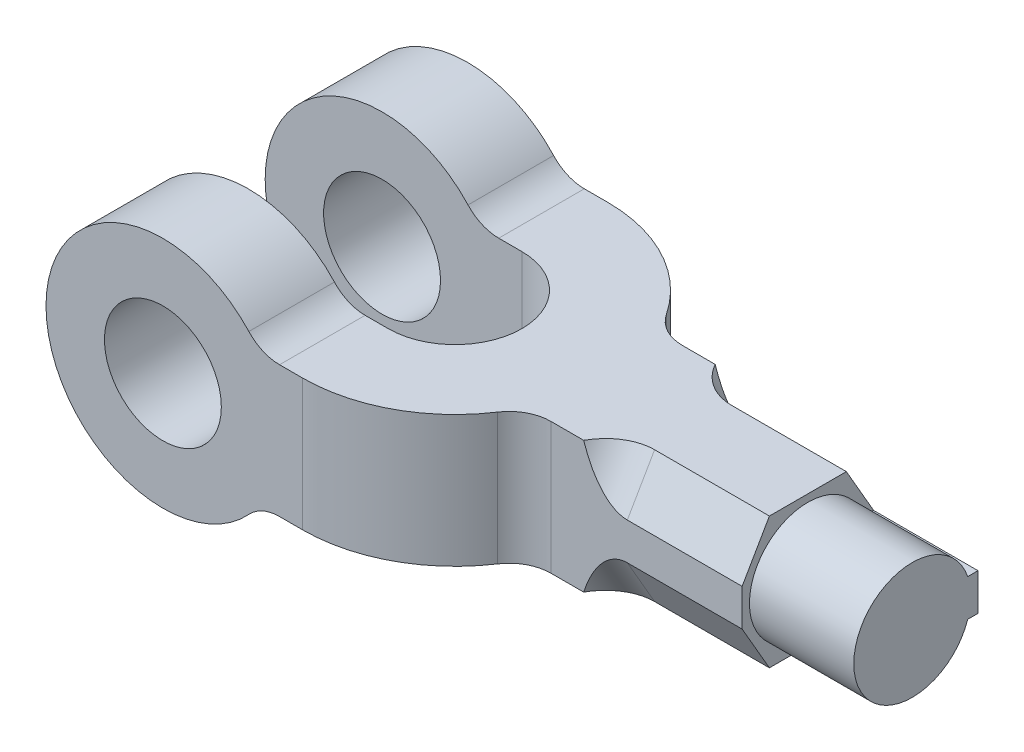
ISO-10303-21;
HEADER;
FILE_DESCRIPTION(('STEP AP214'),'2;1');
FILE_NAME('part.step','',(''),(''),'','','');
FILE_SCHEMA(('AUTOMOTIVE_DESIGN { 1 0 10303 214 1 1 1 1 }'));
ENDSEC;
DATA;
#1=APPLICATION_CONTEXT('core data for automotive mechanical design processes');
#2=APPLICATION_PROTOCOL_DEFINITION('international standard','automotive_design',2000,#1);
#3=PRODUCT_CONTEXT('',#1,'mechanical');
#4=PRODUCT('Part','Part','',(#3));
#5=PRODUCT_RELATED_PRODUCT_CATEGORY('part','',(#4));
#6=PRODUCT_DEFINITION_FORMATION('','',#4);
#7=PRODUCT_DEFINITION_CONTEXT('part definition',#1,'design');
#8=PRODUCT_DEFINITION('design','',#6,#7);
#9=PRODUCT_DEFINITION_SHAPE('','',#8);
#10=(LENGTH_UNIT() NAMED_UNIT(*) SI_UNIT(.MILLI.,.METRE.));
#11=(NAMED_UNIT(*) PLANE_ANGLE_UNIT() SI_UNIT($,.RADIAN.));
#12=(NAMED_UNIT(*) SI_UNIT($,.STERADIAN.) SOLID_ANGLE_UNIT());
#13=UNCERTAINTY_MEASURE_WITH_UNIT(LENGTH_MEASURE(1.E-05),#10,'distance_accuracy_value','');
#14=(GEOMETRIC_REPRESENTATION_CONTEXT(3) GLOBAL_UNCERTAINTY_ASSIGNED_CONTEXT((#13)) GLOBAL_UNIT_ASSIGNED_CONTEXT((#10,
#11,#12)) REPRESENTATION_CONTEXT('',''));
#15=CARTESIAN_POINT('',(0.,0.,0.));
#16=DIRECTION('',(0.,0.,1.));
#17=DIRECTION('',(1.,0.,0.));
#18=AXIS2_PLACEMENT_3D('',#15,#16,#17);
#19=CARTESIAN_POINT('',(236.,0.,0.));
#20=DIRECTION('',(1.,0.,0.));
#21=DIRECTION('',(0.,0.,-1.));
#22=AXIS2_PLACEMENT_3D('',#19,#20,#21);
#23=PLANE('',#22);
#24=CARTESIAN_POINT('',(236.,0.,-32.));
#25=DIRECTION('',(1.,0.,0.));
#26=DIRECTION('',(0.,0.,-1.));
#27=AXIS2_PLACEMENT_3D('',#24,#25,#26);
#28=CIRCLE('',#27,28.);
#29=CARTESIAN_POINT('',(236.,8.86484903614287,-58.5596395225236));
#30=VERTEX_POINT('',#29);
#31=CARTESIAN_POINT('',(236.,-8.86484903614288,-58.5596395225236));
#32=VERTEX_POINT('',#31);
#33=EDGE_CURVE('E256',#30,#32,#28,.T.);
#34=ORIENTED_EDGE('',*,*,#33,.F.);
#35=DIRECTION('',(0.,0.,1.));
#36=VECTOR('',#35,1.);
#37=CARTESIAN_POINT('',(236.,8.86484903614287,-58.5596395225236));
#38=LINE('',#37,#36);
#39=CARTESIAN_POINT('',(236.,8.86484903614287,-63.500000000008));
#40=VERTEX_POINT('',#39);
#41=EDGE_CURVE('E572',#40,#30,#38,.T.);
#42=ORIENTED_EDGE('',*,*,#41,.F.);
#43=DIRECTION('',(0.,0.866025403784438,0.500000000000001));
#44=VECTOR('',#43,1.);
#45=CARTESIAN_POINT('',(236.,0.,-68.6181229773505));
#46=LINE('',#45,#44);
#47=CARTESIAN_POINT('',(236.,31.5,-50.4315894978773));
#48=VERTEX_POINT('',#47);
#49=EDGE_CURVE('E565',#40,#48,#46,.T.);
#50=ORIENTED_EDGE('',*,*,#49,.T.);
#51=DIRECTION('',(0.,0.,1.));
#52=VECTOR('',#51,1.);
#53=CARTESIAN_POINT('',(236.,31.5,-63.500000000008));
#54=LINE('',#53,#52);
#55=CARTESIAN_POINT('',(236.,31.5,-13.5684105021226));
#56=VERTEX_POINT('',#55);
#57=EDGE_CURVE('E275',#48,#56,#54,.T.);
#58=ORIENTED_EDGE('',*,*,#57,.T.);
#59=DIRECTION('',(0.,-0.866025403784442,0.499999999999995));
#60=VECTOR('',#59,1.);
#61=CARTESIAN_POINT('',(236.,31.7122247372881,-13.6909385113246));
#62=LINE('',#61,#60);
#63=CARTESIAN_POINT('',(236.,8.86484903617051,-0.500000000008011));
#64=VERTEX_POINT('',#63);
#65=EDGE_CURVE('E458',#56,#64,#62,.T.);
#66=ORIENTED_EDGE('',*,*,#65,.T.);
#67=DIRECTION('',(0.,-1.,0.));
#68=VECTOR('',#67,1.);
#69=CARTESIAN_POINT('',(236.,-31.5,-0.500000000008015));
#70=LINE('',#69,#68);
#71=CARTESIAN_POINT('',(236.,-8.86484903617074,-0.500000000008015));
#72=VERTEX_POINT('',#71);
#73=EDGE_CURVE('E271',#64,#72,#70,.T.);
#74=ORIENTED_EDGE('',*,*,#73,.T.);
#75=DIRECTION('',(0.,-0.866025403784435,-0.500000000000007));
#76=VECTOR('',#75,1.);
#77=CARTESIAN_POINT('',(236.,-2.55702986077764E-13,4.61812297735051));
#78=LINE('',#77,#76);
#79=CARTESIAN_POINT('',(236.,-31.5,-13.5684105021229));
#80=VERTEX_POINT('',#79);
#81=EDGE_CURVE('E455',#72,#80,#78,.T.);
#82=ORIENTED_EDGE('',*,*,#81,.T.);
#83=DIRECTION('',(0.,0.,-1.));
#84=VECTOR('',#83,1.);
#85=CARTESIAN_POINT('',(236.,-31.5,-63.500000000008));
#86=LINE('',#85,#84);
#87=CARTESIAN_POINT('',(236.,-31.5,-50.4315894978775));
#88=VERTEX_POINT('',#87);
#89=EDGE_CURVE('E276',#80,#88,#86,.T.);
#90=ORIENTED_EDGE('',*,*,#89,.T.);
#91=DIRECTION('',(0.,0.866025403784442,-0.499999999999995));
#92=VECTOR('',#91,1.);
#93=CARTESIAN_POINT('',(236.,-31.712224737288,-50.3090614886756));
#94=LINE('',#93,#92);
#95=CARTESIAN_POINT('',(236.,-8.86484903614287,-63.500000000008));
#96=VERTEX_POINT('',#95);
#97=EDGE_CURVE('E560',#88,#96,#94,.T.);
#98=ORIENTED_EDGE('',*,*,#97,.T.);
#99=DIRECTION('',(0.,0.,-1.));
#100=VECTOR('',#99,1.);
#101=CARTESIAN_POINT('',(236.,-8.86484903614287,-58.5596395225236));
#102=LINE('',#101,#100);
#103=EDGE_CURVE('E247',#32,#96,#102,.T.);
#104=ORIENTED_EDGE('',*,*,#103,.F.);
#105=EDGE_LOOP('',(#34,#42,#50,#58,#66,#74,#82,#90,#98,#104));
#106=FACE_BOUND('',#105,.T.);
#107=ADVANCED_FACE('F47',(#106),#23,.T.);
#108=CARTESIAN_POINT('',(286.,0.,-32.));
#109=DIRECTION('',(-1.,0.,0.));
#110=DIRECTION('',(0.,0.,1.));
#111=AXIS2_PLACEMENT_3D('',#108,#109,#110);
#112=CYLINDRICAL_SURFACE('',#111,28.);
#113=DIRECTION('',(-1.,0.,0.));
#114=VECTOR('',#113,1.);
#115=CARTESIAN_POINT('',(304.405144807415,8.86484903614287,-58.5596395225236));
#116=LINE('',#115,#114);
#117=CARTESIAN_POINT('',(286.,8.86484903614286,-58.5596395225236));
#118=VERTEX_POINT('',#117);
#119=EDGE_CURVE('E257',#118,#30,#116,.T.);
#120=ORIENTED_EDGE('',*,*,#119,.T.);
#121=ORIENTED_EDGE('',*,*,#33,.T.);
#122=DIRECTION('',(-1.,0.,0.));
#123=VECTOR('',#122,1.);
#124=CARTESIAN_POINT('',(304.405144807415,-8.86484903614288,-58.5596395225236));
#125=LINE('',#124,#123);
#126=CARTESIAN_POINT('',(286.,-8.86484903614288,-58.5596395225236));
#127=VERTEX_POINT('',#126);
#128=EDGE_CURVE('E242',#127,#32,#125,.T.);
#129=ORIENTED_EDGE('',*,*,#128,.F.);
#130=CARTESIAN_POINT('',(286.,0.,-32.));
#131=DIRECTION('',(1.,0.,0.));
#132=DIRECTION('',(0.,0.,-1.));
#133=AXIS2_PLACEMENT_3D('',#130,#131,#132);
#134=CIRCLE('',#133,28.);
#135=EDGE_CURVE('E254',#118,#127,#134,.T.);
#136=ORIENTED_EDGE('',*,*,#135,.F.);
#137=EDGE_LOOP('',(#120,#121,#129,#136));
#138=FACE_BOUND('',#137,.T.);
#139=ADVANCED_FACE('F253',(#138),#112,.T.);
#140=CARTESIAN_POINT('',(-56.001,-31.5,-5.34294830600857E-12));
#141=DIRECTION('',(0.,1.,0.));
#142=DIRECTION('',(0.,0.,1.));
#143=AXIS2_PLACEMENT_3D('',#140,#141,#142);
#144=PLANE('',#143);
#145=DIRECTION('',(1.,0.,0.));
#146=VECTOR('',#145,1.);
#147=CARTESIAN_POINT('',(-56.002,-31.5,-63.500000000008));
#148=LINE('',#147,#146);
#149=CARTESIAN_POINT('',(144.409726694759,-31.5,-63.500000000008));
#150=VERTEX_POINT('',#149);
#151=CARTESIAN_POINT('',(160.076538065911,-31.5,-63.500000000008));
#152=VERTEX_POINT('',#151);
#153=EDGE_CURVE('E262',#150,#152,#148,.T.);
#154=ORIENTED_EDGE('',*,*,#153,.T.);
#155=CARTESIAN_POINT('',(181.,-31.5,-79.2991029573587));
#156=DIRECTION('',(0.,1.,0.));
#157=DIRECTION('',(0.,0.,1.));
#158=AXIS2_PLACEMENT_3D('',#155,#156,#157);
#159=ELLIPSE('',#158,28.8675134594812,25.);
#160=CARTESIAN_POINT('',(181.,-31.5,-50.4315894978776));
#161=VERTEX_POINT('',#160);
#162=EDGE_CURVE('E435',#152,#161,#159,.T.);
#163=ORIENTED_EDGE('',*,*,#162,.T.);
#164=DIRECTION('',(-1.,0.,0.));
#165=VECTOR('',#164,1.);
#166=CARTESIAN_POINT('',(-56.001,-31.5,-50.4315894978776));
#167=LINE('',#166,#165);
#168=EDGE_CURVE('E556',#88,#161,#167,.T.);
#169=ORIENTED_EDGE('',*,*,#168,.F.);
#170=ORIENTED_EDGE('',*,*,#89,.F.);
#171=DIRECTION('',(1.,0.,0.));
#172=VECTOR('',#171,1.);
#173=CARTESIAN_POINT('',(-56.001,-31.5,-13.5684105021229));
#174=LINE('',#173,#172);
#175=CARTESIAN_POINT('',(181.,-31.5,-13.5684105021229));
#176=VERTEX_POINT('',#175);
#177=EDGE_CURVE('E260',#176,#80,#174,.T.);
#178=ORIENTED_EDGE('',*,*,#177,.F.);
#179=CARTESIAN_POINT('',(181.,-31.5,15.2991029573585));
#180=DIRECTION('',(0.,1.,0.));
#181=DIRECTION('',(0.,0.,1.));
#182=AXIS2_PLACEMENT_3D('',#179,#180,#181);
#183=ELLIPSE('',#182,28.8675134594814,25.);
#184=CARTESIAN_POINT('',(160.07653806592,-31.5,-0.500000000008015));
#185=VERTEX_POINT('',#184);
#186=EDGE_CURVE('E55',#176,#185,#183,.T.);
#187=ORIENTED_EDGE('',*,*,#186,.T.);
#188=DIRECTION('',(1.,0.,0.));
#189=VECTOR('',#188,1.);
#190=CARTESIAN_POINT('',(-56.002,-31.5,-0.500000000008015));
#191=LINE('',#190,#189);
#192=CARTESIAN_POINT('',(144.409726694762,-31.5,-0.500000000008015));
#193=VERTEX_POINT('',#192);
#194=EDGE_CURVE('E69',#193,#185,#191,.T.);
#195=ORIENTED_EDGE('',*,*,#194,.F.);
#196=CARTESIAN_POINT('',(144.409726694762,-31.5,19.499999999992));
#197=DIRECTION('',(0.,1.,0.));
#198=DIRECTION('',(0.,0.,1.));
#199=AXIS2_PLACEMENT_3D('',#196,#197,#198);
#200=CIRCLE('',#199,20.);
#201=CARTESIAN_POINT('',(127.756245958692,-31.5,8.42473118278826));
#202=VERTEX_POINT('',#201);
#203=EDGE_CURVE('E398',#193,#202,#200,.T.);
#204=ORIENTED_EDGE('',*,*,#203,.T.);
#205=CARTESIAN_POINT('',(66.9710412720338,-31.5,-32.0000000000054));
#206=DIRECTION('',(0.,1.,0.));
#207=DIRECTION('',(0.,0.,1.));
#208=AXIS2_PLACEMENT_3D('',#205,#206,#207);
#209=CIRCLE('',#208,73.);
#210=CARTESIAN_POINT('',(66.971041272027,-31.5,40.9999999999947));
#211=VERTEX_POINT('',#210);
#212=EDGE_CURVE('E312',#211,#202,#209,.T.);
#213=ORIENTED_EDGE('',*,*,#212,.F.);
#214=DIRECTION('',(1.,0.,0.));
#215=VECTOR('',#214,1.);
#216=CARTESIAN_POINT('',(-56.001,-31.5,40.9999999999947));
#217=LINE('',#216,#215);
#218=CARTESIAN_POINT('',(55.8905179793496,-31.5,40.9999999999947));
#219=VERTEX_POINT('',#218);
#220=EDGE_CURVE('E332',#219,#211,#217,.T.);
#221=ORIENTED_EDGE('',*,*,#220,.F.);
#222=DIRECTION('',(0.,0.,1.));
#223=VECTOR('',#222,1.);
#224=CARTESIAN_POINT('',(55.8905179793496,-31.5,0.));
#225=LINE('',#224,#223);
#226=CARTESIAN_POINT('',(55.8905179793496,-31.5,-5.34294830600857E-12));
#227=VERTEX_POINT('',#226);
#228=EDGE_CURVE('E361',#219,#227,#225,.F.);
#229=ORIENTED_EDGE('',*,*,#228,.T.);
#230=DIRECTION('',(1.,0.,0.));
#231=VECTOR('',#230,1.);
#232=CARTESIAN_POINT('',(-56.001,-31.5,-5.34294830600857E-12));
#233=LINE('',#232,#231);
#234=CARTESIAN_POINT('',(66.971041272027,-31.5,-5.34294830600857E-12));
#235=VERTEX_POINT('',#234);
#236=EDGE_CURVE('E336',#227,#235,#233,.T.);
#237=ORIENTED_EDGE('',*,*,#236,.T.);
#238=CARTESIAN_POINT('',(66.9710412720338,-31.5,-32.0000000000054));
#239=DIRECTION('',(0.,-1.,0.));
#240=DIRECTION('',(0.,0.,1.));
#241=AXIS2_PLACEMENT_3D('',#238,#239,#240);
#242=CIRCLE('',#241,32.);
#243=CARTESIAN_POINT('',(66.971041272027,-31.5,-64.0000000000054));
#244=VERTEX_POINT('',#243);
#245=EDGE_CURVE('E307',#244,#235,#242,.T.);
#246=ORIENTED_EDGE('',*,*,#245,.F.);
#247=DIRECTION('',(1.,0.,0.));
#248=VECTOR('',#247,1.);
#249=CARTESIAN_POINT('',(-56.001,-31.5,-64.0000000000054));
#250=LINE('',#249,#248);
#251=CARTESIAN_POINT('',(55.8905179793496,-31.5,-64.0000000000054));
#252=VERTEX_POINT('',#251);
#253=EDGE_CURVE('E303',#252,#244,#250,.T.);
#254=ORIENTED_EDGE('',*,*,#253,.F.);
#255=DIRECTION('',(0.,0.,-1.));
#256=VECTOR('',#255,1.);
#257=CARTESIAN_POINT('',(55.8905179793496,-31.5,-105.));
#258=LINE('',#257,#256);
#259=CARTESIAN_POINT('',(55.8905179793496,-31.5,-105.000000000005));
#260=VERTEX_POINT('',#259);
#261=EDGE_CURVE('E359',#252,#260,#258,.T.);
#262=ORIENTED_EDGE('',*,*,#261,.T.);
#263=DIRECTION('',(1.,0.,0.));
#264=VECTOR('',#263,1.);
#265=CARTESIAN_POINT('',(-56.001,-31.5,-105.000000000005));
#266=LINE('',#265,#264);
#267=CARTESIAN_POINT('',(66.971041272027,-31.5,-105.000000000005));
#268=VERTEX_POINT('',#267);
#269=EDGE_CURVE('E300',#260,#268,#266,.T.);
#270=ORIENTED_EDGE('',*,*,#269,.T.);
#271=CARTESIAN_POINT('',(127.756245958689,-31.5,-72.4247311828032));
#272=VERTEX_POINT('',#271);
#273=EDGE_CURVE('E319',#272,#268,#209,.T.);
#274=ORIENTED_EDGE('',*,*,#273,.F.);
#275=CARTESIAN_POINT('',(144.409726694759,-31.5,-83.500000000008));
#276=DIRECTION('',(0.,1.,0.));
#277=DIRECTION('',(0.,0.,1.));
#278=AXIS2_PLACEMENT_3D('',#275,#276,#277);
#279=CIRCLE('',#278,20.);
#280=EDGE_CURVE('E270',#272,#150,#279,.T.);
#281=ORIENTED_EDGE('',*,*,#280,.T.);
#282=EDGE_LOOP('',(#154,#163,#169,#170,#178,#187,#195,#204,#213,#221,#229,#237,#246,#254,#262,
#270,#274,#281));
#283=FACE_BOUND('',#282,.T.);
#284=ADVANCED_FACE('F444',(#283),#144,.F.);
#285=CARTESIAN_POINT('',(-56.001,31.5,40.9999999999947));
#286=DIRECTION('',(0.,-1.,0.));
#287=DIRECTION('',(0.,0.,-1.));
#288=AXIS2_PLACEMENT_3D('',#285,#286,#287);
#289=PLANE('',#288);
#290=DIRECTION('',(1.,0.,0.));
#291=VECTOR('',#290,1.);
#292=CARTESIAN_POINT('',(-56.002,31.5,-0.500000000008015));
#293=LINE('',#292,#291);
#294=CARTESIAN_POINT('',(144.409726694762,31.5,-0.500000000008015));
#295=VERTEX_POINT('',#294);
#296=CARTESIAN_POINT('',(160.07653806592,31.5,-0.500000000008015));
#297=VERTEX_POINT('',#296);
#298=EDGE_CURVE('E279',#295,#297,#293,.T.);
#299=ORIENTED_EDGE('',*,*,#298,.T.);
#300=CARTESIAN_POINT('',(181.,31.5,15.2991029573586));
#301=DIRECTION('',(0.,-1.,0.));
#302=DIRECTION('',(0.,0.,-1.));
#303=AXIS2_PLACEMENT_3D('',#300,#301,#302);
#304=ELLIPSE('',#303,28.8675134594812,25.);
#305=CARTESIAN_POINT('',(181.,31.5,-13.5684105021226));
#306=VERTEX_POINT('',#305);
#307=EDGE_CURVE('E440',#297,#306,#304,.T.);
#308=ORIENTED_EDGE('',*,*,#307,.T.);
#309=DIRECTION('',(-1.,0.,0.));
#310=VECTOR('',#309,1.);
#311=CARTESIAN_POINT('',(-56.001,31.5,-13.5684105021226));
#312=LINE('',#311,#310);
#313=EDGE_CURVE('E264',#56,#306,#312,.T.);
#314=ORIENTED_EDGE('',*,*,#313,.F.);
#315=ORIENTED_EDGE('',*,*,#57,.F.);
#316=DIRECTION('',(1.,0.,0.));
#317=VECTOR('',#316,1.);
#318=CARTESIAN_POINT('',(-56.001,31.5,-50.4315894978772));
#319=LINE('',#318,#317);
#320=CARTESIAN_POINT('',(181.,31.5,-50.4315894978772));
#321=VERTEX_POINT('',#320);
#322=EDGE_CURVE('E457',#321,#48,#319,.T.);
#323=ORIENTED_EDGE('',*,*,#322,.F.);
#324=CARTESIAN_POINT('',(181.,31.5,-79.2991029573586));
#325=DIRECTION('',(0.,-1.,0.));
#326=DIRECTION('',(0.,0.,-1.));
#327=AXIS2_PLACEMENT_3D('',#324,#325,#326);
#328=ELLIPSE('',#327,28.8675134594813,25.);
#329=CARTESIAN_POINT('',(160.076538065911,31.5,-63.500000000008));
#330=VERTEX_POINT('',#329);
#331=EDGE_CURVE('E427',#321,#330,#328,.T.);
#332=ORIENTED_EDGE('',*,*,#331,.T.);
#333=DIRECTION('',(1.,0.,0.));
#334=VECTOR('',#333,1.);
#335=CARTESIAN_POINT('',(-56.002,31.5,-63.500000000008));
#336=LINE('',#335,#334);
#337=CARTESIAN_POINT('',(144.409726694759,31.5,-63.500000000008));
#338=VERTEX_POINT('',#337);
#339=EDGE_CURVE('E283',#338,#330,#336,.T.);
#340=ORIENTED_EDGE('',*,*,#339,.F.);
#341=CARTESIAN_POINT('',(144.409726694759,31.5,-83.500000000008));
#342=DIRECTION('',(0.,-1.,0.));
#343=DIRECTION('',(0.,0.,-1.));
#344=AXIS2_PLACEMENT_3D('',#341,#342,#343);
#345=CIRCLE('',#344,20.);
#346=CARTESIAN_POINT('',(127.756245958689,31.5,-72.4247311828032));
#347=VERTEX_POINT('',#346);
#348=EDGE_CURVE('E402',#338,#347,#345,.T.);
#349=ORIENTED_EDGE('',*,*,#348,.T.);
#350=CARTESIAN_POINT('',(66.9710412720338,31.5,-32.0000000000054));
#351=DIRECTION('',(0.,1.,0.));
#352=DIRECTION('',(0.,0.,1.));
#353=AXIS2_PLACEMENT_3D('',#350,#351,#352);
#354=CIRCLE('',#353,73.);
#355=CARTESIAN_POINT('',(66.971041272027,31.5,-105.000000000005));
#356=VERTEX_POINT('',#355);
#357=EDGE_CURVE('E311',#347,#356,#354,.T.);
#358=ORIENTED_EDGE('',*,*,#357,.T.);
#359=DIRECTION('',(1.,0.,0.));
#360=VECTOR('',#359,1.);
#361=CARTESIAN_POINT('',(-56.001,31.5,-105.000000000005));
#362=LINE('',#361,#360);
#363=CARTESIAN_POINT('',(55.8905179793496,31.5,-105.000000000005));
#364=VERTEX_POINT('',#363);
#365=EDGE_CURVE('E295',#364,#356,#362,.T.);
#366=ORIENTED_EDGE('',*,*,#365,.F.);
#367=DIRECTION('',(0.,0.,-1.));
#368=VECTOR('',#367,1.);
#369=CARTESIAN_POINT('',(55.8905179793496,31.5,-64.));
#370=LINE('',#369,#368);
#371=CARTESIAN_POINT('',(55.8905179793496,31.5,-64.0000000000054));
#372=VERTEX_POINT('',#371);
#373=EDGE_CURVE('E369',#364,#372,#370,.F.);
#374=ORIENTED_EDGE('',*,*,#373,.T.);
#375=DIRECTION('',(1.,0.,0.));
#376=VECTOR('',#375,1.);
#377=CARTESIAN_POINT('',(-56.001,31.5,-64.0000000000054));
#378=LINE('',#377,#376);
#379=CARTESIAN_POINT('',(66.971041272027,31.5,-64.0000000000054));
#380=VERTEX_POINT('',#379);
#381=EDGE_CURVE('E305',#372,#380,#378,.T.);
#382=ORIENTED_EDGE('',*,*,#381,.T.);
#383=CARTESIAN_POINT('',(66.9710412720338,31.5,-32.0000000000054));
#384=DIRECTION('',(0.,-1.,0.));
#385=DIRECTION('',(0.,0.,1.));
#386=AXIS2_PLACEMENT_3D('',#383,#384,#385);
#387=CIRCLE('',#386,32.);
#388=CARTESIAN_POINT('',(66.971041272027,31.5,-5.34294830600857E-12));
#389=VERTEX_POINT('',#388);
#390=EDGE_CURVE('E308',#380,#389,#387,.T.);
#391=ORIENTED_EDGE('',*,*,#390,.T.);
#392=DIRECTION('',(1.,0.,0.));
#393=VECTOR('',#392,1.);
#394=CARTESIAN_POINT('',(-56.001,31.5,-5.34294830600857E-12));
#395=LINE('',#394,#393);
#396=CARTESIAN_POINT('',(55.8905179793496,31.5,-5.34294830600857E-12));
#397=VERTEX_POINT('',#396);
#398=EDGE_CURVE('E327',#397,#389,#395,.T.);
#399=ORIENTED_EDGE('',*,*,#398,.F.);
#400=DIRECTION('',(0.,0.,1.));
#401=VECTOR('',#400,1.);
#402=CARTESIAN_POINT('',(55.8905179793496,31.5,40.9999999999947));
#403=LINE('',#402,#401);
#404=CARTESIAN_POINT('',(55.8905179793496,31.5,40.9999999999947));
#405=VERTEX_POINT('',#404);
#406=EDGE_CURVE('E371',#397,#405,#403,.T.);
#407=ORIENTED_EDGE('',*,*,#406,.T.);
#408=DIRECTION('',(1.,0.,0.));
#409=VECTOR('',#408,1.);
#410=CARTESIAN_POINT('',(-56.001,31.5,40.9999999999947));
#411=LINE('',#410,#409);
#412=CARTESIAN_POINT('',(66.9710412720271,31.5,40.9999999999947));
#413=VERTEX_POINT('',#412);
#414=EDGE_CURVE('E331',#405,#413,#411,.T.);
#415=ORIENTED_EDGE('',*,*,#414,.T.);
#416=CARTESIAN_POINT('',(127.756245958692,31.5,8.42473118278826));
#417=VERTEX_POINT('',#416);
#418=EDGE_CURVE('E313',#413,#417,#354,.T.);
#419=ORIENTED_EDGE('',*,*,#418,.T.);
#420=CARTESIAN_POINT('',(144.409726694762,31.5,19.499999999992));
#421=DIRECTION('',(0.,-1.,0.));
#422=DIRECTION('',(0.,0.,-1.));
#423=AXIS2_PLACEMENT_3D('',#420,#421,#422);
#424=CIRCLE('',#423,20.);
#425=EDGE_CURVE('E400',#417,#295,#424,.T.);
#426=ORIENTED_EDGE('',*,*,#425,.T.);
#427=EDGE_LOOP('',(#299,#308,#314,#315,#323,#332,#340,#349,#358,#366,#374,#382,#391,#399,#407,
#415,#419,#426));
#428=FACE_BOUND('',#427,.T.);
#429=ADVANCED_FACE('F471',(#428),#289,.F.);
#430=CARTESIAN_POINT('',(-56.002,-31.5,-0.500000000008015));
#431=DIRECTION('',(0.,0.,1.));
#432=DIRECTION('',(1.,0.,0.));
#433=AXIS2_PLACEMENT_3D('',#430,#431,#432);
#434=PLANE('',#433);
#435=ORIENTED_EDGE('',*,*,#194,.T.);
#436=CARTESIAN_POINT('',(181.,-58.86484903617,-0.500000000008015));
#437=DIRECTION('',(0.,0.,1.));
#438=DIRECTION('',(0.,1.,0.));
#439=AXIS2_PLACEMENT_3D('',#436,#437,#438);
#440=ELLIPSE('',#439,49.9999999999993,25.);
#441=CARTESIAN_POINT('',(181.,-8.86484903617074,-0.500000000008015));
#442=VERTEX_POINT('',#441);
#443=EDGE_CURVE('E13',#185,#442,#440,.F.);
#444=ORIENTED_EDGE('',*,*,#443,.T.);
#445=DIRECTION('',(1.,0.,0.));
#446=VECTOR('',#445,1.);
#447=CARTESIAN_POINT('',(-56.002,-8.86484903617074,-0.500000000008015));
#448=LINE('',#447,#446);
#449=EDGE_CURVE('E413',#442,#72,#448,.T.);
#450=ORIENTED_EDGE('',*,*,#449,.T.);
#451=ORIENTED_EDGE('',*,*,#73,.F.);
#452=DIRECTION('',(-1.,0.,0.));
#453=VECTOR('',#452,1.);
#454=CARTESIAN_POINT('',(-56.002,8.86484903617051,-0.500000000008015));
#455=LINE('',#454,#453);
#456=CARTESIAN_POINT('',(181.,8.86484903617051,-0.500000000008012));
#457=VERTEX_POINT('',#456);
#458=EDGE_CURVE('E410',#64,#457,#455,.T.);
#459=ORIENTED_EDGE('',*,*,#458,.T.);
#460=CARTESIAN_POINT('',(181.,58.864849036171,-0.500000000008015));
#461=DIRECTION('',(0.,0.,1.));
#462=DIRECTION('',(0.,1.,0.));
#463=AXIS2_PLACEMENT_3D('',#460,#461,#462);
#464=ELLIPSE('',#463,50.0000000000005,25.);
#465=EDGE_CURVE('E437',#457,#297,#464,.F.);
#466=ORIENTED_EDGE('',*,*,#465,.T.);
#467=ORIENTED_EDGE('',*,*,#298,.F.);
#468=DIRECTION('',(0.,-1.,0.));
#469=VECTOR('',#468,1.);
#470=CARTESIAN_POINT('',(144.409726694762,-31.5,-0.500000000008015));
#471=LINE('',#470,#469);
#472=EDGE_CURVE('E389',#295,#193,#471,.T.);
#473=ORIENTED_EDGE('',*,*,#472,.T.);
#474=EDGE_LOOP('',(#435,#444,#450,#451,#459,#466,#467,#473));
#475=FACE_BOUND('',#474,.T.);
#476=ADVANCED_FACE('F449',(#475),#434,.T.);
#477=CARTESIAN_POINT('',(-56.002,-31.5,-63.500000000008));
#478=DIRECTION('',(0.,0.,-1.));
#479=DIRECTION('',(0.,1.,0.));
#480=AXIS2_PLACEMENT_3D('',#477,#478,#479);
#481=PLANE('',#480);
#482=DIRECTION('',(-1.,0.,0.));
#483=VECTOR('',#482,1.);
#484=CARTESIAN_POINT('',(-56.002,-8.86484903614302,-63.500000000008));
#485=LINE('',#484,#483);
#486=CARTESIAN_POINT('',(181.,-8.86484903614302,-63.500000000008));
#487=VERTEX_POINT('',#486);
#488=EDGE_CURVE('E407',#96,#487,#485,.T.);
#489=ORIENTED_EDGE('',*,*,#488,.T.);
#490=CARTESIAN_POINT('',(181.,-58.8648490361436,-63.500000000008));
#491=DIRECTION('',(0.,0.,-1.));
#492=DIRECTION('',(0.,-1.,0.));
#493=AXIS2_PLACEMENT_3D('',#490,#491,#492);
#494=ELLIPSE('',#493,50.0000000000005,25.);
#495=EDGE_CURVE('E432',#487,#152,#494,.F.);
#496=ORIENTED_EDGE('',*,*,#495,.T.);
#497=ORIENTED_EDGE('',*,*,#153,.F.);
#498=DIRECTION('',(0.,-1.,0.));
#499=VECTOR('',#498,1.);
#500=CARTESIAN_POINT('',(144.409726694759,-31.5,-63.500000000008));
#501=LINE('',#500,#499);
#502=EDGE_CURVE('E393',#150,#338,#501,.F.);
#503=ORIENTED_EDGE('',*,*,#502,.T.);
#504=ORIENTED_EDGE('',*,*,#339,.T.);
#505=CARTESIAN_POINT('',(181.,58.8648490361428,-63.500000000008));
#506=DIRECTION('',(0.,0.,-1.));
#507=DIRECTION('',(0.,-1.,0.));
#508=AXIS2_PLACEMENT_3D('',#505,#506,#507);
#509=ELLIPSE('',#508,49.9999999999999,25.);
#510=CARTESIAN_POINT('',(181.,8.86484903614287,-63.500000000008));
#511=VERTEX_POINT('',#510);
#512=EDGE_CURVE('E430',#330,#511,#509,.F.);
#513=ORIENTED_EDGE('',*,*,#512,.T.);
#514=DIRECTION('',(1.,0.,0.));
#515=VECTOR('',#514,1.);
#516=CARTESIAN_POINT('',(-56.002,8.86484903614287,-63.500000000008));
#517=LINE('',#516,#515);
#518=EDGE_CURVE('E269',#511,#40,#517,.T.);
#519=ORIENTED_EDGE('',*,*,#518,.T.);
#520=DIRECTION('',(-1.,0.,0.));
#521=VECTOR('',#520,1.);
#522=CARTESIAN_POINT('',(304.405144807415,8.86484903614287,-63.500000000008));
#523=LINE('',#522,#521);
#524=CARTESIAN_POINT('',(286.,8.86484903614287,-63.500000000008));
#525=VERTEX_POINT('',#524);
#526=EDGE_CURVE('E569',#525,#40,#523,.T.);
#527=ORIENTED_EDGE('',*,*,#526,.F.);
#528=DIRECTION('',(0.,1.,0.));
#529=VECTOR('',#528,1.);
#530=CARTESIAN_POINT('',(286.,-8.86484903614287,-63.500000000008));
#531=LINE('',#530,#529);
#532=CARTESIAN_POINT('',(286.,-8.86484903614287,-63.500000000008));
#533=VERTEX_POINT('',#532);
#534=EDGE_CURVE('E246',#533,#525,#531,.T.);
#535=ORIENTED_EDGE('',*,*,#534,.F.);
#536=DIRECTION('',(-1.,0.,0.));
#537=VECTOR('',#536,1.);
#538=CARTESIAN_POINT('',(304.405144807415,-8.86484903614287,-63.500000000008));
#539=LINE('',#538,#537);
#540=EDGE_CURVE('E244',#533,#96,#539,.T.);
#541=ORIENTED_EDGE('',*,*,#540,.T.);
#542=EDGE_LOOP('',(#489,#496,#497,#503,#504,#513,#519,#527,#535,#541));
#543=FACE_BOUND('',#542,.T.);
#544=ADVANCED_FACE('F548',(#543),#481,.T.);
#545=CARTESIAN_POINT('',(66.9710412720338,31.5,-32.0000000000054));
#546=DIRECTION('',(0.,-1.,0.));
#547=DIRECTION('',(0.,0.,-1.));
#548=AXIS2_PLACEMENT_3D('',#545,#546,#547);
#549=CYLINDRICAL_SURFACE('',#548,73.);
#550=ORIENTED_EDGE('',*,*,#212,.T.);
#551=DIRECTION('',(0.,-1.,0.));
#552=VECTOR('',#551,1.);
#553=CARTESIAN_POINT('',(127.756245958692,31.5,8.42473118278827));
#554=LINE('',#553,#552);
#555=EDGE_CURVE('E391',#202,#417,#554,.F.);
#556=ORIENTED_EDGE('',*,*,#555,.T.);
#557=ORIENTED_EDGE('',*,*,#418,.F.);
#558=DIRECTION('',(0.,1.,0.));
#559=VECTOR('',#558,1.);
#560=CARTESIAN_POINT('',(66.971041272027,-31.5,40.9999999999947));
#561=LINE('',#560,#559);
#562=EDGE_CURVE('E328',#211,#413,#561,.T.);
#563=ORIENTED_EDGE('',*,*,#562,.F.);
#564=EDGE_LOOP('',(#550,#556,#557,#563));
#565=FACE_BOUND('',#564,.T.);
#566=ADVANCED_FACE('F482',(#565),#549,.T.);
#567=CARTESIAN_POINT('',(0.,0.,41.));
#568=DIRECTION('',(0.,0.,-1.));
#569=DIRECTION('',(-1.,0.,0.));
#570=AXIS2_PLACEMENT_3D('',#567,#568,#569);
#571=CYLINDRICAL_SURFACE('',#570,56.);
#572=CARTESIAN_POINT('',(0.,0.,0.));
#573=DIRECTION('',(0.,0.,1.));
#574=DIRECTION('',(1.,0.,0.));
#575=AXIS2_PLACEMENT_3D('',#572,#573,#574);
#576=CIRCLE('',#575,56.);
#577=CARTESIAN_POINT('',(41.1824869321523,37.9473684210526,0.));
#578=VERTEX_POINT('',#577);
#579=CARTESIAN_POINT('',(41.1824869321523,-37.9473684210526,0.));
#580=VERTEX_POINT('',#579);
#581=EDGE_CURVE('E345',#578,#580,#576,.T.);
#582=ORIENTED_EDGE('',*,*,#581,.T.);
#583=DIRECTION('',(0.,0.,-1.));
#584=VECTOR('',#583,1.);
#585=CARTESIAN_POINT('',(41.1824869321523,-37.9473684210526,41.));
#586=LINE('',#585,#584);
#587=CARTESIAN_POINT('',(41.1824869321523,-37.9473684210526,41.));
#588=VERTEX_POINT('',#587);
#589=EDGE_CURVE('E356',#580,#588,#586,.F.);
#590=ORIENTED_EDGE('',*,*,#589,.T.);
#591=CARTESIAN_POINT('',(0.,0.,41.));
#592=DIRECTION('',(0.,0.,1.));
#593=DIRECTION('',(1.,0.,0.));
#594=AXIS2_PLACEMENT_3D('',#591,#592,#593);
#595=CIRCLE('',#594,56.);
#596=CARTESIAN_POINT('',(41.1824869321523,37.9473684210526,41.));
#597=VERTEX_POINT('',#596);
#598=EDGE_CURVE('E348',#597,#588,#595,.T.);
#599=ORIENTED_EDGE('',*,*,#598,.F.);
#600=DIRECTION('',(0.,0.,-1.));
#601=VECTOR('',#600,1.);
#602=CARTESIAN_POINT('',(41.1824869321523,37.9473684210526,41.));
#603=LINE('',#602,#601);
#604=EDGE_CURVE('E351',#597,#578,#603,.T.);
#605=ORIENTED_EDGE('',*,*,#604,.T.);
#606=EDGE_LOOP('',(#582,#590,#599,#605));
#607=FACE_BOUND('',#606,.T.);
#608=ADVANCED_FACE('F500',(#607),#571,.T.);
#609=CARTESIAN_POINT('',(0.,0.,41.));
#610=DIRECTION('',(0.,0.,1.));
#611=DIRECTION('',(1.,0.,0.));
#612=AXIS2_PLACEMENT_3D('',#609,#610,#611);
#613=PLANE('',#612);
#614=ORIENTED_EDGE('',*,*,#414,.F.);
#615=CARTESIAN_POINT('',(55.8905179793496,51.5,41.));
#616=DIRECTION('',(0.,0.,1.));
#617=DIRECTION('',(1.,0.,0.));
#618=AXIS2_PLACEMENT_3D('',#615,#616,#617);
#619=CIRCLE('',#618,20.);
#620=EDGE_CURVE('E383',#405,#597,#619,.F.);
#621=ORIENTED_EDGE('',*,*,#620,.T.);
#622=ORIENTED_EDGE('',*,*,#598,.T.);
#623=CARTESIAN_POINT('',(55.8905179793496,-51.5,41.));
#624=DIRECTION('',(0.,0.,1.));
#625=DIRECTION('',(1.,0.,0.));
#626=AXIS2_PLACEMENT_3D('',#623,#624,#625);
#627=CIRCLE('',#626,20.);
#628=EDGE_CURVE('E373',#588,#219,#627,.F.);
#629=ORIENTED_EDGE('',*,*,#628,.T.);
#630=ORIENTED_EDGE('',*,*,#220,.T.);
#631=ORIENTED_EDGE('',*,*,#562,.T.);
#632=EDGE_LOOP('',(#614,#621,#622,#629,#630,#631));
#633=FACE_BOUND('',#632,.T.);
#634=CARTESIAN_POINT('',(0.,0.,41.));
#635=DIRECTION('',(0.,0.,1.));
#636=DIRECTION('',(1.,0.,0.));
#637=AXIS2_PLACEMENT_3D('',#634,#635,#636);
#638=CIRCLE('',#637,28.);
#639=CARTESIAN_POINT('',(28.,0.,41.));
#640=VERTEX_POINT('',#639);
#641=EDGE_CURVE('E342',#640,#640,#638,.T.);
#642=ORIENTED_EDGE('',*,*,#641,.F.);
#643=EDGE_LOOP('',(#642));
#644=FACE_BOUND('',#643,.T.);
#645=ADVANCED_FACE('F486',(#633,#644),#613,.T.);
#646=CARTESIAN_POINT('',(0.,0.,0.));
#647=DIRECTION('',(0.,0.,1.));
#648=DIRECTION('',(1.,0.,0.));
#649=AXIS2_PLACEMENT_3D('',#646,#647,#648);
#650=PLANE('',#649);
#651=ORIENTED_EDGE('',*,*,#581,.F.);
#652=CARTESIAN_POINT('',(55.8905179793496,51.5,0.));
#653=DIRECTION('',(0.,0.,1.));
#654=DIRECTION('',(1.,0.,0.));
#655=AXIS2_PLACEMENT_3D('',#652,#653,#654);
#656=CIRCLE('',#655,20.);
#657=EDGE_CURVE('E381',#578,#397,#656,.T.);
#658=ORIENTED_EDGE('',*,*,#657,.T.);
#659=ORIENTED_EDGE('',*,*,#398,.T.);
#660=DIRECTION('',(0.,-1.,0.));
#661=VECTOR('',#660,1.);
#662=CARTESIAN_POINT('',(66.971041272027,31.5,-5.34294830600857E-12));
#663=LINE('',#662,#661);
#664=EDGE_CURVE('E333',#389,#235,#663,.T.);
#665=ORIENTED_EDGE('',*,*,#664,.T.);
#666=ORIENTED_EDGE('',*,*,#236,.F.);
#667=CARTESIAN_POINT('',(55.8905179793496,-51.5,0.));
#668=DIRECTION('',(0.,0.,1.));
#669=DIRECTION('',(1.,0.,0.));
#670=AXIS2_PLACEMENT_3D('',#667,#668,#669);
#671=CIRCLE('',#670,20.);
#672=EDGE_CURVE('E375',#227,#580,#671,.T.);
#673=ORIENTED_EDGE('',*,*,#672,.T.);
#674=EDGE_LOOP('',(#651,#658,#659,#665,#666,#673));
#675=FACE_BOUND('',#674,.T.);
#676=CARTESIAN_POINT('',(0.,0.,0.));
#677=DIRECTION('',(0.,0.,1.));
#678=DIRECTION('',(1.,0.,0.));
#679=AXIS2_PLACEMENT_3D('',#676,#677,#678);
#680=CIRCLE('',#679,28.);
#681=CARTESIAN_POINT('',(28.,0.,0.));
#682=VERTEX_POINT('',#681);
#683=EDGE_CURVE('E341',#682,#682,#680,.T.);
#684=ORIENTED_EDGE('',*,*,#683,.T.);
#685=EDGE_LOOP('',(#684));
#686=FACE_BOUND('',#685,.T.);
#687=ADVANCED_FACE('F497',(#675,#686),#650,.F.);
#688=CARTESIAN_POINT('',(0.,0.,41.));
#689=DIRECTION('',(0.,0.,-1.));
#690=DIRECTION('',(-1.,0.,0.));
#691=AXIS2_PLACEMENT_3D('',#688,#689,#690);
#692=CYLINDRICAL_SURFACE('',#691,28.);
#693=ORIENTED_EDGE('',*,*,#641,.T.);
#694=EDGE_LOOP('',(#693));
#695=FACE_BOUND('',#694,.T.);
#696=ORIENTED_EDGE('',*,*,#683,.F.);
#697=EDGE_LOOP('',(#696));
#698=FACE_BOUND('',#697,.T.);
#699=ADVANCED_FACE('F625',(#695,#698),#692,.F.);
#700=CARTESIAN_POINT('',(66.9710412720338,31.5,-32.0000000000054));
#701=DIRECTION('',(0.,-1.,0.));
#702=DIRECTION('',(0.,0.,-1.));
#703=AXIS2_PLACEMENT_3D('',#700,#701,#702);
#704=CYLINDRICAL_SURFACE('',#703,32.);
#705=ORIENTED_EDGE('',*,*,#245,.T.);
#706=ORIENTED_EDGE('',*,*,#664,.F.);
#707=ORIENTED_EDGE('',*,*,#390,.F.);
#708=DIRECTION('',(0.,-1.,0.));
#709=VECTOR('',#708,1.);
#710=CARTESIAN_POINT('',(66.971041272027,31.5,-64.0000000000054));
#711=LINE('',#710,#709);
#712=EDGE_CURVE('E316',#380,#244,#711,.T.);
#713=ORIENTED_EDGE('',*,*,#712,.T.);
#714=EDGE_LOOP('',(#705,#706,#707,#713));
#715=FACE_BOUND('',#714,.T.);
#716=ADVANCED_FACE('F512',(#715),#704,.F.);
#717=ORIENTED_EDGE('',*,*,#357,.F.);
#718=DIRECTION('',(0.,-1.,0.));
#719=VECTOR('',#718,1.);
#720=CARTESIAN_POINT('',(127.756245958689,31.5,-72.4247311828032));
#721=LINE('',#720,#719);
#722=EDGE_CURVE('E396',#347,#272,#721,.T.);
#723=ORIENTED_EDGE('',*,*,#722,.T.);
#724=ORIENTED_EDGE('',*,*,#273,.T.);
#725=DIRECTION('',(0.,-1.,0.));
#726=VECTOR('',#725,1.);
#727=CARTESIAN_POINT('',(66.971041272027,31.5,-105.000000000005));
#728=LINE('',#727,#726);
#729=EDGE_CURVE('E324',#356,#268,#728,.T.);
#730=ORIENTED_EDGE('',*,*,#729,.F.);
#731=EDGE_LOOP('',(#717,#723,#724,#730));
#732=FACE_BOUND('',#731,.T.);
#733=ADVANCED_FACE('F540',(#732),#549,.T.);
#734=CARTESIAN_POINT('',(-56.001,31.5,-105.000000000005));
#735=DIRECTION('',(0.,0.,1.));
#736=DIRECTION('',(1.,0.,0.));
#737=AXIS2_PLACEMENT_3D('',#734,#735,#736);
#738=PLANE('',#737);
#739=ORIENTED_EDGE('',*,*,#269,.F.);
#740=CARTESIAN_POINT('',(55.8905179793496,-51.5,-105.000000000005));
#741=DIRECTION('',(0.,0.,1.));
#742=DIRECTION('',(1.,0.,0.));
#743=AXIS2_PLACEMENT_3D('',#740,#741,#742);
#744=CIRCLE('',#743,20.);
#745=CARTESIAN_POINT('',(41.1824869321523,-37.9473684210526,-105.));
#746=VERTEX_POINT('',#745);
#747=EDGE_CURVE('E379',#260,#746,#744,.T.);
#748=ORIENTED_EDGE('',*,*,#747,.T.);
#749=CARTESIAN_POINT('',(0.,0.,-105.));
#750=DIRECTION('',(0.,0.,1.));
#751=DIRECTION('',(1.,0.,0.));
#752=AXIS2_PLACEMENT_3D('',#749,#750,#751);
#753=CIRCLE('',#752,56.);
#754=CARTESIAN_POINT('',(41.1824869321523,37.9473684210526,-105.));
#755=VERTEX_POINT('',#754);
#756=EDGE_CURVE('E292',#755,#746,#753,.T.);
#757=ORIENTED_EDGE('',*,*,#756,.F.);
#758=CARTESIAN_POINT('',(55.8905179793496,51.5,-105.000000000005));
#759=DIRECTION('',(0.,0.,1.));
#760=DIRECTION('',(1.,0.,0.));
#761=AXIS2_PLACEMENT_3D('',#758,#759,#760);
#762=CIRCLE('',#761,20.);
#763=EDGE_CURVE('E385',#755,#364,#762,.T.);
#764=ORIENTED_EDGE('',*,*,#763,.T.);
#765=ORIENTED_EDGE('',*,*,#365,.T.);
#766=ORIENTED_EDGE('',*,*,#729,.T.);
#767=EDGE_LOOP('',(#739,#748,#757,#764,#765,#766));
#768=FACE_BOUND('',#767,.T.);
#769=CARTESIAN_POINT('',(0.,0.,-105.));
#770=DIRECTION('',(0.,0.,1.));
#771=DIRECTION('',(1.,0.,0.));
#772=AXIS2_PLACEMENT_3D('',#769,#770,#771);
#773=CIRCLE('',#772,28.);
#774=CARTESIAN_POINT('',(28.,0.,-105.));
#775=VERTEX_POINT('',#774);
#776=EDGE_CURVE('E286',#775,#775,#773,.T.);
#777=ORIENTED_EDGE('',*,*,#776,.T.);
#778=EDGE_LOOP('',(#777));
#779=FACE_BOUND('',#778,.T.);
#780=ADVANCED_FACE('F524',(#768,#779),#738,.F.);
#781=CARTESIAN_POINT('',(-56.001,-31.5,-64.0000000000054));
#782=DIRECTION('',(0.,0.,-1.));
#783=DIRECTION('',(-1.,0.,0.));
#784=AXIS2_PLACEMENT_3D('',#781,#782,#783);
#785=PLANE('',#784);
#786=ORIENTED_EDGE('',*,*,#381,.F.);
#787=CARTESIAN_POINT('',(55.8905179793496,51.5,-64.0000000000054));
#788=DIRECTION('',(0.,0.,-1.));
#789=DIRECTION('',(-1.,0.,0.));
#790=AXIS2_PLACEMENT_3D('',#787,#788,#789);
#791=CIRCLE('',#790,20.);
#792=CARTESIAN_POINT('',(41.1824869321523,37.9473684210526,-64.));
#793=VERTEX_POINT('',#792);
#794=EDGE_CURVE('E387',#372,#793,#791,.T.);
#795=ORIENTED_EDGE('',*,*,#794,.T.);
#796=CARTESIAN_POINT('',(0.,0.,-64.));
#797=DIRECTION('',(0.,0.,1.));
#798=DIRECTION('',(1.,0.,0.));
#799=AXIS2_PLACEMENT_3D('',#796,#797,#798);
#800=CIRCLE('',#799,56.);
#801=CARTESIAN_POINT('',(41.1824869321523,-37.9473684210526,-64.));
#802=VERTEX_POINT('',#801);
#803=EDGE_CURVE('E289',#793,#802,#800,.T.);
#804=ORIENTED_EDGE('',*,*,#803,.T.);
#805=CARTESIAN_POINT('',(55.8905179793496,-51.5,-64.0000000000054));
#806=DIRECTION('',(0.,0.,-1.));
#807=DIRECTION('',(-1.,0.,0.));
#808=AXIS2_PLACEMENT_3D('',#805,#806,#807);
#809=CIRCLE('',#808,20.);
#810=EDGE_CURVE('E377',#802,#252,#809,.T.);
#811=ORIENTED_EDGE('',*,*,#810,.T.);
#812=ORIENTED_EDGE('',*,*,#253,.T.);
#813=ORIENTED_EDGE('',*,*,#712,.F.);
#814=EDGE_LOOP('',(#786,#795,#804,#811,#812,#813));
#815=FACE_BOUND('',#814,.T.);
#816=CARTESIAN_POINT('',(0.,0.,-64.));
#817=DIRECTION('',(0.,0.,1.));
#818=DIRECTION('',(1.,0.,0.));
#819=AXIS2_PLACEMENT_3D('',#816,#817,#818);
#820=CIRCLE('',#819,28.);
#821=CARTESIAN_POINT('',(28.,0.,-64.));
#822=VERTEX_POINT('',#821);
#823=EDGE_CURVE('E274',#822,#822,#820,.T.);
#824=ORIENTED_EDGE('',*,*,#823,.F.);
#825=EDGE_LOOP('',(#824));
#826=FACE_BOUND('',#825,.T.);
#827=ADVANCED_FACE('F616',(#815,#826),#785,.F.);
#828=CARTESIAN_POINT('',(0.,0.,-105.));
#829=DIRECTION('',(0.,0.,1.));
#830=DIRECTION('',(-1.,0.,0.));
#831=AXIS2_PLACEMENT_3D('',#828,#829,#830);
#832=CYLINDRICAL_SURFACE('',#831,56.);
#833=ORIENTED_EDGE('',*,*,#756,.T.);
#834=DIRECTION('',(0.,0.,1.));
#835=VECTOR('',#834,1.);
#836=CARTESIAN_POINT('',(41.1824869321523,-37.9473684210526,-105.));
#837=LINE('',#836,#835);
#838=EDGE_CURVE('E366',#746,#802,#837,.T.);
#839=ORIENTED_EDGE('',*,*,#838,.T.);
#840=ORIENTED_EDGE('',*,*,#803,.F.);
#841=DIRECTION('',(0.,0.,1.));
#842=VECTOR('',#841,1.);
#843=CARTESIAN_POINT('',(41.1824869321523,37.9473684210526,-105.));
#844=LINE('',#843,#842);
#845=EDGE_CURVE('E363',#793,#755,#844,.F.);
#846=ORIENTED_EDGE('',*,*,#845,.T.);
#847=EDGE_LOOP('',(#833,#839,#840,#846));
#848=FACE_BOUND('',#847,.T.);
#849=ADVANCED_FACE('F527',(#848),#832,.T.);
#850=CARTESIAN_POINT('',(0.,0.,-105.));
#851=DIRECTION('',(0.,0.,1.));
#852=DIRECTION('',(-1.,0.,0.));
#853=AXIS2_PLACEMENT_3D('',#850,#851,#852);
#854=CYLINDRICAL_SURFACE('',#853,28.);
#855=ORIENTED_EDGE('',*,*,#776,.F.);
#856=EDGE_LOOP('',(#855));
#857=FACE_BOUND('',#856,.T.);
#858=ORIENTED_EDGE('',*,*,#823,.T.);
#859=EDGE_LOOP('',(#858));
#860=FACE_BOUND('',#859,.T.);
#861=ADVANCED_FACE('F610',(#857,#860),#854,.F.);
#862=CARTESIAN_POINT('',(55.8905179793496,-51.5,41.));
#863=DIRECTION('',(0.,0.,-1.));
#864=DIRECTION('',(-1.,0.,0.));
#865=AXIS2_PLACEMENT_3D('',#862,#863,#864);
#866=CYLINDRICAL_SURFACE('',#865,20.);
#867=ORIENTED_EDGE('',*,*,#672,.F.);
#868=ORIENTED_EDGE('',*,*,#228,.F.);
#869=ORIENTED_EDGE('',*,*,#628,.F.);
#870=ORIENTED_EDGE('',*,*,#589,.F.);
#871=EDGE_LOOP('',(#867,#868,#869,#870));
#872=FACE_BOUND('',#871,.T.);
#873=ADVANCED_FACE('F493',(#872),#866,.F.);
#874=CARTESIAN_POINT('',(55.8905179793496,-51.5,-105.));
#875=DIRECTION('',(0.,0.,1.));
#876=DIRECTION('',(1.,0.,0.));
#877=AXIS2_PLACEMENT_3D('',#874,#875,#876);
#878=CYLINDRICAL_SURFACE('',#877,20.);
#879=ORIENTED_EDGE('',*,*,#747,.F.);
#880=ORIENTED_EDGE('',*,*,#261,.F.);
#881=ORIENTED_EDGE('',*,*,#810,.F.);
#882=ORIENTED_EDGE('',*,*,#838,.F.);
#883=EDGE_LOOP('',(#879,#880,#881,#882));
#884=FACE_BOUND('',#883,.T.);
#885=ADVANCED_FACE('F520',(#884),#878,.F.);
#886=CARTESIAN_POINT('',(55.8905179793496,51.5,41.));
#887=DIRECTION('',(0.,0.,-1.));
#888=DIRECTION('',(-1.,0.,0.));
#889=AXIS2_PLACEMENT_3D('',#886,#887,#888);
#890=CYLINDRICAL_SURFACE('',#889,20.);
#891=ORIENTED_EDGE('',*,*,#620,.F.);
#892=ORIENTED_EDGE('',*,*,#406,.F.);
#893=ORIENTED_EDGE('',*,*,#657,.F.);
#894=ORIENTED_EDGE('',*,*,#604,.F.);
#895=EDGE_LOOP('',(#891,#892,#893,#894));
#896=FACE_BOUND('',#895,.T.);
#897=ADVANCED_FACE('F504',(#896),#890,.F.);
#898=CARTESIAN_POINT('',(55.8905179793496,51.5,-105.));
#899=DIRECTION('',(0.,0.,1.));
#900=DIRECTION('',(1.,0.,0.));
#901=AXIS2_PLACEMENT_3D('',#898,#899,#900);
#902=CYLINDRICAL_SURFACE('',#901,20.);
#903=ORIENTED_EDGE('',*,*,#794,.F.);
#904=ORIENTED_EDGE('',*,*,#373,.F.);
#905=ORIENTED_EDGE('',*,*,#763,.F.);
#906=ORIENTED_EDGE('',*,*,#845,.F.);
#907=EDGE_LOOP('',(#903,#904,#905,#906));
#908=FACE_BOUND('',#907,.T.);
#909=ADVANCED_FACE('F532',(#908),#902,.F.);
#910=CARTESIAN_POINT('',(144.409726694762,31.5,19.499999999992));
#911=DIRECTION('',(0.,-1.,0.));
#912=DIRECTION('',(0.,0.,-1.));
#913=AXIS2_PLACEMENT_3D('',#910,#911,#912);
#914=CYLINDRICAL_SURFACE('',#913,20.);
#915=ORIENTED_EDGE('',*,*,#425,.F.);
#916=ORIENTED_EDGE('',*,*,#555,.F.);
#917=ORIENTED_EDGE('',*,*,#203,.F.);
#918=ORIENTED_EDGE('',*,*,#472,.F.);
#919=EDGE_LOOP('',(#915,#916,#917,#918));
#920=FACE_BOUND('',#919,.T.);
#921=ADVANCED_FACE('F476',(#920),#914,.F.);
#922=CARTESIAN_POINT('',(144.409726694759,31.5,-83.500000000008));
#923=DIRECTION('',(0.,-1.,0.));
#924=DIRECTION('',(0.,0.,-1.));
#925=AXIS2_PLACEMENT_3D('',#922,#923,#924);
#926=CYLINDRICAL_SURFACE('',#925,20.);
#927=ORIENTED_EDGE('',*,*,#280,.F.);
#928=ORIENTED_EDGE('',*,*,#722,.F.);
#929=ORIENTED_EDGE('',*,*,#348,.F.);
#930=ORIENTED_EDGE('',*,*,#502,.F.);
#931=EDGE_LOOP('',(#927,#928,#929,#930));
#932=FACE_BOUND('',#931,.T.);
#933=ADVANCED_FACE('F544',(#932),#926,.F.);
#934=CARTESIAN_POINT('',(286.,0.,-32.));
#935=DIRECTION('',(1.,0.,0.));
#936=DIRECTION('',(0.,0.,-1.));
#937=AXIS2_PLACEMENT_3D('',#934,#935,#936);
#938=PLANE('',#937);
#939=ORIENTED_EDGE('',*,*,#135,.T.);
#940=DIRECTION('',(0.,0.,-1.));
#941=VECTOR('',#940,1.);
#942=CARTESIAN_POINT('',(286.,-8.86484903614287,-58.5596395225236));
#943=LINE('',#942,#941);
#944=EDGE_CURVE('E238',#127,#533,#943,.T.);
#945=ORIENTED_EDGE('',*,*,#944,.T.);
#946=ORIENTED_EDGE('',*,*,#534,.T.);
#947=DIRECTION('',(0.,0.,1.));
#948=VECTOR('',#947,1.);
#949=CARTESIAN_POINT('',(286.,8.86484903614287,-58.5596395225236));
#950=LINE('',#949,#948);
#951=EDGE_CURVE('E62',#525,#118,#950,.T.);
#952=ORIENTED_EDGE('',*,*,#951,.T.);
#953=EDGE_LOOP('',(#939,#945,#946,#952));
#954=FACE_BOUND('',#953,.T.);
#955=ADVANCED_FACE('F259',(#954),#938,.T.);
#956=CARTESIAN_POINT('',(156.,0.,-68.6181229773505));
#957=DIRECTION('',(0.,0.500000000000001,-0.866025403784438));
#958=DIRECTION('',(0.,0.866025403784438,0.500000000000001));
#959=AXIS2_PLACEMENT_3D('',#956,#957,#958);
#960=PLANE('',#959);
#961=ORIENTED_EDGE('',*,*,#518,.F.);
#962=DIRECTION('',(0.,0.866025403784438,0.500000000000001));
#963=VECTOR('',#962,1.);
#964=CARTESIAN_POINT('',(181.,31.5,-50.4315894978772));
#965=LINE('',#964,#963);
#966=EDGE_CURVE('E415',#511,#321,#965,.T.);
#967=ORIENTED_EDGE('',*,*,#966,.T.);
#968=ORIENTED_EDGE('',*,*,#322,.T.);
#969=ORIENTED_EDGE('',*,*,#49,.F.);
#970=EDGE_LOOP('',(#961,#967,#968,#969));
#971=FACE_BOUND('',#970,.T.);
#972=ADVANCED_FACE('F585',(#971),#960,.T.);
#973=CARTESIAN_POINT('',(156.,-31.712224737288,-50.3090614886756));
#974=DIRECTION('',(0.,-0.499999999999995,-0.866025403784442));
#975=DIRECTION('',(0.,0.866025403784442,-0.499999999999995));
#976=AXIS2_PLACEMENT_3D('',#973,#974,#975);
#977=PLANE('',#976);
#978=ORIENTED_EDGE('',*,*,#168,.T.);
#979=DIRECTION('',(0.,0.866025403784442,-0.499999999999995));
#980=VECTOR('',#979,1.);
#981=CARTESIAN_POINT('',(181.,-8.86484903614302,-63.500000000008));
#982=LINE('',#981,#980);
#983=EDGE_CURVE('E418',#161,#487,#982,.T.);
#984=ORIENTED_EDGE('',*,*,#983,.T.);
#985=ORIENTED_EDGE('',*,*,#488,.F.);
#986=ORIENTED_EDGE('',*,*,#97,.F.);
#987=EDGE_LOOP('',(#978,#984,#985,#986));
#988=FACE_BOUND('',#987,.T.);
#989=ADVANCED_FACE('F558',(#988),#977,.T.);
#990=CARTESIAN_POINT('',(156.,31.7122247372881,-13.6909385113246));
#991=DIRECTION('',(0.,0.499999999999995,0.866025403784442));
#992=DIRECTION('',(0.,-0.866025403784442,0.499999999999995));
#993=AXIS2_PLACEMENT_3D('',#990,#991,#992);
#994=PLANE('',#993);
#995=ORIENTED_EDGE('',*,*,#313,.T.);
#996=DIRECTION('',(0.,-0.866025403784442,0.499999999999995));
#997=VECTOR('',#996,1.);
#998=CARTESIAN_POINT('',(181.,8.86484903617051,-0.500000000008008));
#999=LINE('',#998,#997);
#1000=EDGE_CURVE('E421',#306,#457,#999,.T.);
#1001=ORIENTED_EDGE('',*,*,#1000,.T.);
#1002=ORIENTED_EDGE('',*,*,#458,.F.);
#1003=ORIENTED_EDGE('',*,*,#65,.F.);
#1004=EDGE_LOOP('',(#995,#1001,#1002,#1003));
#1005=FACE_BOUND('',#1004,.T.);
#1006=ADVANCED_FACE('F465',(#1005),#994,.T.);
#1007=CARTESIAN_POINT('',(156.,-2.55702986077764E-13,4.61812297735051));
#1008=DIRECTION('',(0.,-0.500000000000007,0.866025403784434));
#1009=DIRECTION('',(0.,-0.866025403784435,-0.500000000000007));
#1010=AXIS2_PLACEMENT_3D('',#1007,#1008,#1009);
#1011=PLANE('',#1010);
#1012=ORIENTED_EDGE('',*,*,#449,.F.);
#1013=DIRECTION('',(0.,-0.866025403784435,-0.500000000000007));
#1014=VECTOR('',#1013,1.);
#1015=CARTESIAN_POINT('',(181.,-31.5,-13.5684105021229));
#1016=LINE('',#1015,#1014);
#1017=EDGE_CURVE('E424',#442,#176,#1016,.T.);
#1018=ORIENTED_EDGE('',*,*,#1017,.T.);
#1019=ORIENTED_EDGE('',*,*,#177,.T.);
#1020=ORIENTED_EDGE('',*,*,#81,.F.);
#1021=EDGE_LOOP('',(#1012,#1018,#1019,#1020));
#1022=FACE_BOUND('',#1021,.T.);
#1023=ADVANCED_FACE('F453',(#1022),#1011,.T.);
#1024=CARTESIAN_POINT('',(181.,12.5,-90.2687580719615));
#1025=DIRECTION('',(0.,-0.866025403784438,-0.500000000000001));
#1026=DIRECTION('',(0.,0.500000000000001,-0.866025403784438));
#1027=AXIS2_PLACEMENT_3D('',#1024,#1025,#1026);
#1028=CYLINDRICAL_SURFACE('',#1027,25.);
#1029=ORIENTED_EDGE('',*,*,#966,.F.);
#1030=ORIENTED_EDGE('',*,*,#512,.F.);
#1031=ORIENTED_EDGE('',*,*,#331,.F.);
#1032=EDGE_LOOP('',(#1029,#1030,#1031));
#1033=FACE_BOUND('',#1032,.T.);
#1034=ADVANCED_FACE('F588',(#1033),#1028,.F.);
#1035=CARTESIAN_POINT('',(181.,-44.2122247372879,-71.9596965832867));
#1036=DIRECTION('',(0.,-0.866025403784442,0.499999999999995));
#1037=DIRECTION('',(0.,-0.499999999999995,-0.866025403784442));
#1038=AXIS2_PLACEMENT_3D('',#1035,#1036,#1037);
#1039=CYLINDRICAL_SURFACE('',#1038,25.);
#1040=ORIENTED_EDGE('',*,*,#162,.F.);
#1041=ORIENTED_EDGE('',*,*,#495,.F.);
#1042=ORIENTED_EDGE('',*,*,#983,.F.);
#1043=EDGE_LOOP('',(#1040,#1041,#1042));
#1044=FACE_BOUND('',#1043,.T.);
#1045=ADVANCED_FACE('F553',(#1044),#1039,.F.);
#1046=CARTESIAN_POINT('',(181.,44.212224737288,7.95969658328644));
#1047=DIRECTION('',(0.,0.866025403784442,-0.499999999999995));
#1048=DIRECTION('',(0.,0.499999999999995,0.866025403784442));
#1049=AXIS2_PLACEMENT_3D('',#1046,#1047,#1048);
#1050=CYLINDRICAL_SURFACE('',#1049,25.);
#1051=ORIENTED_EDGE('',*,*,#307,.F.);
#1052=ORIENTED_EDGE('',*,*,#465,.F.);
#1053=ORIENTED_EDGE('',*,*,#1000,.F.);
#1054=EDGE_LOOP('',(#1051,#1052,#1053));
#1055=FACE_BOUND('',#1054,.T.);
#1056=ADVANCED_FACE('F469',(#1055),#1050,.F.);
#1057=CARTESIAN_POINT('',(181.,-12.5000000000004,26.2687580719614));
#1058=DIRECTION('',(0.,0.866025403784435,0.500000000000007));
#1059=DIRECTION('',(0.,-0.500000000000007,0.866025403784434));
#1060=AXIS2_PLACEMENT_3D('',#1057,#1058,#1059);
#1061=CYLINDRICAL_SURFACE('',#1060,25.);
#1062=ORIENTED_EDGE('',*,*,#1017,.F.);
#1063=ORIENTED_EDGE('',*,*,#443,.F.);
#1064=ORIENTED_EDGE('',*,*,#186,.F.);
#1065=EDGE_LOOP('',(#1062,#1063,#1064));
#1066=FACE_BOUND('',#1065,.T.);
#1067=ADVANCED_FACE('F49',(#1066),#1061,.F.);
#1068=CARTESIAN_POINT('',(304.405144807415,8.86484903614287,-58.5596395225236));
#1069=DIRECTION('',(0.,-1.,0.));
#1070=DIRECTION('',(0.,0.,-1.));
#1071=AXIS2_PLACEMENT_3D('',#1068,#1069,#1070);
#1072=PLANE('',#1071);
#1073=ORIENTED_EDGE('',*,*,#951,.F.);
#1074=ORIENTED_EDGE('',*,*,#526,.T.);
#1075=ORIENTED_EDGE('',*,*,#41,.T.);
#1076=ORIENTED_EDGE('',*,*,#119,.F.);
#1077=EDGE_LOOP('',(#1073,#1074,#1075,#1076));
#1078=FACE_BOUND('',#1077,.T.);
#1079=ADVANCED_FACE('F661',(#1078),#1072,.F.);
#1080=CARTESIAN_POINT('',(304.405144807415,-8.86484903614287,-58.5596395225236));
#1081=DIRECTION('',(0.,1.,0.));
#1082=DIRECTION('',(0.,0.,1.));
#1083=AXIS2_PLACEMENT_3D('',#1080,#1081,#1082);
#1084=PLANE('',#1083);
#1085=ORIENTED_EDGE('',*,*,#944,.F.);
#1086=ORIENTED_EDGE('',*,*,#128,.T.);
#1087=ORIENTED_EDGE('',*,*,#103,.T.);
#1088=ORIENTED_EDGE('',*,*,#540,.F.);
#1089=EDGE_LOOP('',(#1085,#1086,#1087,#1088));
#1090=FACE_BOUND('',#1089,.T.);
#1091=ADVANCED_FACE('F240',(#1090),#1084,.F.);
#1092=CLOSED_SHELL('',(#107,#139,#284,#429,#476,#544,#566,#608,#645,#687,#699,#716,#733,#780,
#827,#849,#861,#873,#885,#897,#909,#921,#933,#955,#972,#989,#1006,#1023,#1034,#1045,#1056,#1067,
#1079,#1091));
#1093=MANIFOLD_SOLID_BREP('B2',#1092);
#1094=ADVANCED_BREP_SHAPE_REPRESENTATION('',(#18,#1093),#14);
#1095=SHAPE_DEFINITION_REPRESENTATION(#9,#1094);
ENDSEC;
END-ISO-10303-21;
